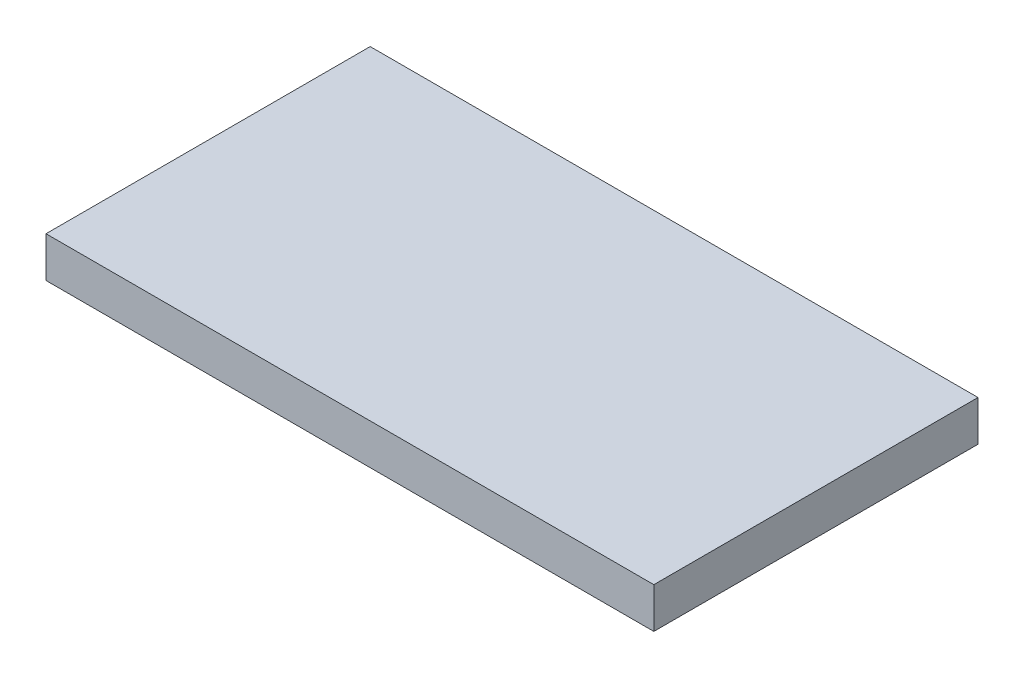
ISO-10303-21;
HEADER;
FILE_DESCRIPTION(('STEP AP214'),'2;1');
FILE_NAME('part.step','',(''),(''),'','','');
FILE_SCHEMA(('AUTOMOTIVE_DESIGN { 1 0 10303 214 1 1 1 1 }'));
ENDSEC;
DATA;
#1=APPLICATION_CONTEXT('core data for automotive mechanical design processes');
#2=APPLICATION_PROTOCOL_DEFINITION('international standard','automotive_design',2000,#1);
#3=PRODUCT_CONTEXT('',#1,'mechanical');
#4=PRODUCT('Part','Part','',(#3));
#5=PRODUCT_RELATED_PRODUCT_CATEGORY('part','',(#4));
#6=PRODUCT_DEFINITION_FORMATION('','',#4);
#7=PRODUCT_DEFINITION_CONTEXT('part definition',#1,'design');
#8=PRODUCT_DEFINITION('design','',#6,#7);
#9=PRODUCT_DEFINITION_SHAPE('','',#8);
#10=(LENGTH_UNIT() NAMED_UNIT(*) SI_UNIT(.MILLI.,.METRE.));
#11=(NAMED_UNIT(*) PLANE_ANGLE_UNIT() SI_UNIT($,.RADIAN.));
#12=(NAMED_UNIT(*) SI_UNIT($,.STERADIAN.) SOLID_ANGLE_UNIT());
#13=UNCERTAINTY_MEASURE_WITH_UNIT(LENGTH_MEASURE(1.E-05),#10,'distance_accuracy_value','');
#14=(GEOMETRIC_REPRESENTATION_CONTEXT(3) GLOBAL_UNCERTAINTY_ASSIGNED_CONTEXT((#13)) GLOBAL_UNIT_ASSIGNED_CONTEXT((#10,
#11,#12)) REPRESENTATION_CONTEXT('',''));
#15=CARTESIAN_POINT('',(0.,0.,0.));
#16=DIRECTION('',(0.,0.,1.));
#17=DIRECTION('',(1.,0.,0.));
#18=AXIS2_PLACEMENT_3D('',#15,#16,#17);
#19=CARTESIAN_POINT('',(-65.,-7.5,0.));
#20=DIRECTION('',(1.,0.,0.));
#21=DIRECTION('',(0.,0.,-1.));
#22=AXIS2_PLACEMENT_3D('',#19,#20,#21);
#23=PLANE('',#22);
#24=DIRECTION('',(0.,0.,-1.));
#25=VECTOR('',#24,1.);
#26=CARTESIAN_POINT('',(-65.,0.,0.));
#27=LINE('',#26,#25);
#28=CARTESIAN_POINT('',(-65.,0.,30.));
#29=VERTEX_POINT('',#28);
#30=CARTESIAN_POINT('',(-65.,0.,-30.));
#31=VERTEX_POINT('',#30);
#32=EDGE_CURVE('E119',#29,#31,#27,.T.);
#33=ORIENTED_EDGE('',*,*,#32,.T.);
#34=DIRECTION('',(0.,1.,0.));
#35=VECTOR('',#34,1.);
#36=CARTESIAN_POINT('',(-65.,-7.5,-30.));
#37=LINE('',#36,#35);
#38=CARTESIAN_POINT('',(-65.,-7.5,-30.));
#39=VERTEX_POINT('',#38);
#40=EDGE_CURVE('E11',#39,#31,#37,.T.);
#41=ORIENTED_EDGE('',*,*,#40,.F.);
#42=DIRECTION('',(0.,0.,-1.));
#43=VECTOR('',#42,1.);
#44=CARTESIAN_POINT('',(-65.,-7.5,0.));
#45=LINE('',#44,#43);
#46=CARTESIAN_POINT('',(-65.,-7.5,30.));
#47=VERTEX_POINT('',#46);
#48=EDGE_CURVE('E54',#47,#39,#45,.T.);
#49=ORIENTED_EDGE('',*,*,#48,.F.);
#50=DIRECTION('',(0.,1.,0.));
#51=VECTOR('',#50,1.);
#52=CARTESIAN_POINT('',(-65.,-7.5,30.));
#53=LINE('',#52,#51);
#54=EDGE_CURVE('E39',#47,#29,#53,.T.);
#55=ORIENTED_EDGE('',*,*,#54,.T.);
#56=EDGE_LOOP('',(#33,#41,#49,#55));
#57=FACE_BOUND('',#56,.T.);
#58=ADVANCED_FACE('F36',(#57),#23,.F.);
#59=CARTESIAN_POINT('',(0.,-7.5,-30.));
#60=DIRECTION('',(0.,0.,-1.));
#61=DIRECTION('',(-1.,0.,0.));
#62=AXIS2_PLACEMENT_3D('',#59,#60,#61);
#63=PLANE('',#62);
#64=DIRECTION('',(-1.,0.,0.));
#65=VECTOR('',#64,1.);
#66=CARTESIAN_POINT('',(0.,0.,-30.));
#67=LINE('',#66,#65);
#68=CARTESIAN_POINT('',(65.,0.,-30.));
#69=VERTEX_POINT('',#68);
#70=EDGE_CURVE('E152',#69,#31,#67,.T.);
#71=ORIENTED_EDGE('',*,*,#70,.F.);
#72=DIRECTION('',(0.,1.,0.));
#73=VECTOR('',#72,1.);
#74=CARTESIAN_POINT('',(65.,-7.5,-30.));
#75=LINE('',#74,#73);
#76=CARTESIAN_POINT('',(65.,-7.5,-30.));
#77=VERTEX_POINT('',#76);
#78=EDGE_CURVE('E45',#77,#69,#75,.T.);
#79=ORIENTED_EDGE('',*,*,#78,.F.);
#80=DIRECTION('',(-1.,0.,0.));
#81=VECTOR('',#80,1.);
#82=CARTESIAN_POINT('',(0.,-7.5,-30.));
#83=LINE('',#82,#81);
#84=EDGE_CURVE('E156',#77,#39,#83,.T.);
#85=ORIENTED_EDGE('',*,*,#84,.T.);
#86=ORIENTED_EDGE('',*,*,#40,.T.);
#87=EDGE_LOOP('',(#71,#79,#85,#86));
#88=FACE_BOUND('',#87,.T.);
#89=ADVANCED_FACE('F175',(#88),#63,.T.);
#90=CARTESIAN_POINT('',(65.,-7.5,0.));
#91=DIRECTION('',(1.,0.,0.));
#92=DIRECTION('',(0.,0.,-1.));
#93=AXIS2_PLACEMENT_3D('',#90,#91,#92);
#94=PLANE('',#93);
#95=DIRECTION('',(0.,0.,-1.));
#96=VECTOR('',#95,1.);
#97=CARTESIAN_POINT('',(65.,0.,0.));
#98=LINE('',#97,#96);
#99=CARTESIAN_POINT('',(65.,0.,30.));
#100=VERTEX_POINT('',#99);
#101=EDGE_CURVE('E162',#100,#69,#98,.T.);
#102=ORIENTED_EDGE('',*,*,#101,.F.);
#103=DIRECTION('',(0.,1.,0.));
#104=VECTOR('',#103,1.);
#105=CARTESIAN_POINT('',(65.,-7.5,30.));
#106=LINE('',#105,#104);
#107=CARTESIAN_POINT('',(65.,-7.5,30.));
#108=VERTEX_POINT('',#107);
#109=EDGE_CURVE('E69',#108,#100,#106,.T.);
#110=ORIENTED_EDGE('',*,*,#109,.F.);
#111=DIRECTION('',(0.,0.,-1.));
#112=VECTOR('',#111,1.);
#113=CARTESIAN_POINT('',(65.,-7.5,0.));
#114=LINE('',#113,#112);
#115=EDGE_CURVE('E154',#108,#77,#114,.T.);
#116=ORIENTED_EDGE('',*,*,#115,.T.);
#117=ORIENTED_EDGE('',*,*,#78,.T.);
#118=EDGE_LOOP('',(#102,#110,#116,#117));
#119=FACE_BOUND('',#118,.T.);
#120=ADVANCED_FACE('F177',(#119),#94,.T.);
#121=CARTESIAN_POINT('',(0.,-7.5,30.));
#122=DIRECTION('',(0.,0.,-1.));
#123=DIRECTION('',(-1.,0.,0.));
#124=AXIS2_PLACEMENT_3D('',#121,#122,#123);
#125=PLANE('',#124);
#126=DIRECTION('',(-1.,0.,0.));
#127=VECTOR('',#126,1.);
#128=CARTESIAN_POINT('',(0.,0.,30.));
#129=LINE('',#128,#127);
#130=EDGE_CURVE('E160',#100,#29,#129,.T.);
#131=ORIENTED_EDGE('',*,*,#130,.T.);
#132=ORIENTED_EDGE('',*,*,#54,.F.);
#133=DIRECTION('',(-1.,0.,0.));
#134=VECTOR('',#133,1.);
#135=CARTESIAN_POINT('',(0.,-7.5,30.));
#136=LINE('',#135,#134);
#137=EDGE_CURVE('E78',#108,#47,#136,.T.);
#138=ORIENTED_EDGE('',*,*,#137,.F.);
#139=ORIENTED_EDGE('',*,*,#109,.T.);
#140=EDGE_LOOP('',(#131,#132,#138,#139));
#141=FACE_BOUND('',#140,.T.);
#142=ADVANCED_FACE('F178',(#141),#125,.F.);
#143=CARTESIAN_POINT('',(0.,-7.5,0.));
#144=DIRECTION('',(0.,1.,0.));
#145=DIRECTION('',(0.,0.,1.));
#146=AXIS2_PLACEMENT_3D('',#143,#144,#145);
#147=PLANE('',#146);
#148=ORIENTED_EDGE('',*,*,#48,.T.);
#149=ORIENTED_EDGE('',*,*,#84,.F.);
#150=ORIENTED_EDGE('',*,*,#115,.F.);
#151=ORIENTED_EDGE('',*,*,#137,.T.);
#152=EDGE_LOOP('',(#148,#149,#150,#151));
#153=FACE_BOUND('',#152,.T.);
#154=ADVANCED_FACE('F176',(#153),#147,.F.);
#155=CARTESIAN_POINT('',(-75.,10.,0.));
#156=DIRECTION('',(-1.,0.,0.));
#157=DIRECTION('',(0.,0.,1.));
#158=AXIS2_PLACEMENT_3D('',#155,#156,#157);
#159=PLANE('',#158);
#160=DIRECTION('',(0.,0.,-1.));
#161=VECTOR('',#160,1.);
#162=CARTESIAN_POINT('',(-75.,0.,0.));
#163=LINE('',#162,#161);
#164=CARTESIAN_POINT('',(-75.,0.,40.));
#165=VERTEX_POINT('',#164);
#166=CARTESIAN_POINT('',(-75.,0.,-40.));
#167=VERTEX_POINT('',#166);
#168=EDGE_CURVE('E114',#165,#167,#163,.T.);
#169=ORIENTED_EDGE('',*,*,#168,.F.);
#170=DIRECTION('',(0.,-1.,0.));
#171=VECTOR('',#170,1.);
#172=CARTESIAN_POINT('',(-75.,10.,40.));
#173=LINE('',#172,#171);
#174=CARTESIAN_POINT('',(-75.,10.,40.));
#175=VERTEX_POINT('',#174);
#176=EDGE_CURVE('E109',#175,#165,#173,.T.);
#177=ORIENTED_EDGE('',*,*,#176,.F.);
#178=DIRECTION('',(0.,0.,-1.));
#179=VECTOR('',#178,1.);
#180=CARTESIAN_POINT('',(-75.,10.,0.));
#181=LINE('',#180,#179);
#182=CARTESIAN_POINT('',(-75.,10.,-40.));
#183=VERTEX_POINT('',#182);
#184=EDGE_CURVE('E112',#175,#183,#181,.T.);
#185=ORIENTED_EDGE('',*,*,#184,.T.);
#186=DIRECTION('',(0.,-1.,0.));
#187=VECTOR('',#186,1.);
#188=CARTESIAN_POINT('',(-75.,10.,-40.));
#189=LINE('',#188,#187);
#190=EDGE_CURVE('E138',#183,#167,#189,.T.);
#191=ORIENTED_EDGE('',*,*,#190,.T.);
#192=EDGE_LOOP('',(#169,#177,#185,#191));
#193=FACE_BOUND('',#192,.T.);
#194=ADVANCED_FACE('F111',(#193),#159,.T.);
#195=CARTESIAN_POINT('',(0.,10.,40.));
#196=DIRECTION('',(0.,0.,1.));
#197=DIRECTION('',(1.,0.,0.));
#198=AXIS2_PLACEMENT_3D('',#195,#196,#197);
#199=PLANE('',#198);
#200=DIRECTION('',(-1.,0.,0.));
#201=VECTOR('',#200,1.);
#202=CARTESIAN_POINT('',(0.,0.,40.));
#203=LINE('',#202,#201);
#204=CARTESIAN_POINT('',(75.,0.,40.));
#205=VERTEX_POINT('',#204);
#206=EDGE_CURVE('E140',#205,#165,#203,.T.);
#207=ORIENTED_EDGE('',*,*,#206,.F.);
#208=DIRECTION('',(0.,-1.,0.));
#209=VECTOR('',#208,1.);
#210=CARTESIAN_POINT('',(75.,10.,40.));
#211=LINE('',#210,#209);
#212=CARTESIAN_POINT('',(75.,10.,40.));
#213=VERTEX_POINT('',#212);
#214=EDGE_CURVE('E120',#213,#205,#211,.T.);
#215=ORIENTED_EDGE('',*,*,#214,.F.);
#216=DIRECTION('',(-1.,0.,0.));
#217=VECTOR('',#216,1.);
#218=CARTESIAN_POINT('',(0.,10.,40.));
#219=LINE('',#218,#217);
#220=EDGE_CURVE('E125',#213,#175,#219,.T.);
#221=ORIENTED_EDGE('',*,*,#220,.T.);
#222=ORIENTED_EDGE('',*,*,#176,.T.);
#223=EDGE_LOOP('',(#207,#215,#221,#222));
#224=FACE_BOUND('',#223,.T.);
#225=ADVANCED_FACE('F131',(#224),#199,.T.);
#226=CARTESIAN_POINT('',(75.,10.,0.));
#227=DIRECTION('',(-1.,0.,0.));
#228=DIRECTION('',(0.,0.,1.));
#229=AXIS2_PLACEMENT_3D('',#226,#227,#228);
#230=PLANE('',#229);
#231=DIRECTION('',(0.,0.,-1.));
#232=VECTOR('',#231,1.);
#233=CARTESIAN_POINT('',(75.,0.,0.));
#234=LINE('',#233,#232);
#235=CARTESIAN_POINT('',(75.,0.,-40.));
#236=VERTEX_POINT('',#235);
#237=EDGE_CURVE('E142',#205,#236,#234,.T.);
#238=ORIENTED_EDGE('',*,*,#237,.T.);
#239=DIRECTION('',(0.,-1.,0.));
#240=VECTOR('',#239,1.);
#241=CARTESIAN_POINT('',(75.,10.,-40.));
#242=LINE('',#241,#240);
#243=CARTESIAN_POINT('',(75.,10.,-40.));
#244=VERTEX_POINT('',#243);
#245=EDGE_CURVE('E147',#244,#236,#242,.T.);
#246=ORIENTED_EDGE('',*,*,#245,.F.);
#247=DIRECTION('',(0.,0.,-1.));
#248=VECTOR('',#247,1.);
#249=CARTESIAN_POINT('',(75.,10.,0.));
#250=LINE('',#249,#248);
#251=EDGE_CURVE('E133',#213,#244,#250,.T.);
#252=ORIENTED_EDGE('',*,*,#251,.F.);
#253=ORIENTED_EDGE('',*,*,#214,.T.);
#254=EDGE_LOOP('',(#238,#246,#252,#253));
#255=FACE_BOUND('',#254,.T.);
#256=ADVANCED_FACE('F198',(#255),#230,.F.);
#257=CARTESIAN_POINT('',(0.,10.,-40.));
#258=DIRECTION('',(0.,0.,1.));
#259=DIRECTION('',(1.,0.,0.));
#260=AXIS2_PLACEMENT_3D('',#257,#258,#259);
#261=PLANE('',#260);
#262=DIRECTION('',(-1.,0.,0.));
#263=VECTOR('',#262,1.);
#264=CARTESIAN_POINT('',(0.,0.,-40.));
#265=LINE('',#264,#263);
#266=EDGE_CURVE('E129',#236,#167,#265,.T.);
#267=ORIENTED_EDGE('',*,*,#266,.T.);
#268=ORIENTED_EDGE('',*,*,#190,.F.);
#269=DIRECTION('',(-1.,0.,0.));
#270=VECTOR('',#269,1.);
#271=CARTESIAN_POINT('',(0.,10.,-40.));
#272=LINE('',#271,#270);
#273=EDGE_CURVE('E127',#244,#183,#272,.T.);
#274=ORIENTED_EDGE('',*,*,#273,.F.);
#275=ORIENTED_EDGE('',*,*,#245,.T.);
#276=EDGE_LOOP('',(#267,#268,#274,#275));
#277=FACE_BOUND('',#276,.T.);
#278=ADVANCED_FACE('F201',(#277),#261,.F.);
#279=CARTESIAN_POINT('',(0.,10.,0.));
#280=DIRECTION('',(0.,1.,0.));
#281=DIRECTION('',(0.,0.,1.));
#282=AXIS2_PLACEMENT_3D('',#279,#280,#281);
#283=PLANE('',#282);
#284=ORIENTED_EDGE('',*,*,#184,.F.);
#285=ORIENTED_EDGE('',*,*,#220,.F.);
#286=ORIENTED_EDGE('',*,*,#251,.T.);
#287=ORIENTED_EDGE('',*,*,#273,.T.);
#288=EDGE_LOOP('',(#284,#285,#286,#287));
#289=FACE_BOUND('',#288,.T.);
#290=ADVANCED_FACE('F124',(#289),#283,.T.);
#291=CARTESIAN_POINT('',(0.,0.,0.));
#292=DIRECTION('',(0.,1.,0.));
#293=DIRECTION('',(0.,0.,1.));
#294=AXIS2_PLACEMENT_3D('',#291,#292,#293);
#295=PLANE('',#294);
#296=ORIENTED_EDGE('',*,*,#32,.F.);
#297=ORIENTED_EDGE('',*,*,#130,.F.);
#298=ORIENTED_EDGE('',*,*,#101,.T.);
#299=ORIENTED_EDGE('',*,*,#70,.T.);
#300=EDGE_LOOP('',(#296,#297,#298,#299));
#301=FACE_BOUND('',#300,.T.);
#302=ORIENTED_EDGE('',*,*,#168,.T.);
#303=ORIENTED_EDGE('',*,*,#266,.F.);
#304=ORIENTED_EDGE('',*,*,#237,.F.);
#305=ORIENTED_EDGE('',*,*,#206,.T.);
#306=EDGE_LOOP('',(#302,#303,#304,#305));
#307=FACE_BOUND('',#306,.T.);
#308=ADVANCED_FACE('F172',(#301,#307),#295,.F.);
#309=CLOSED_SHELL('',(#58,#89,#120,#142,#154,#194,#225,#256,#278,#290,#308));
#310=MANIFOLD_SOLID_BREP('B2',#309);
#311=ADVANCED_BREP_SHAPE_REPRESENTATION('',(#18,#310),#14);
#312=SHAPE_DEFINITION_REPRESENTATION(#9,#311);
ENDSEC;
END-ISO-10303-21;
